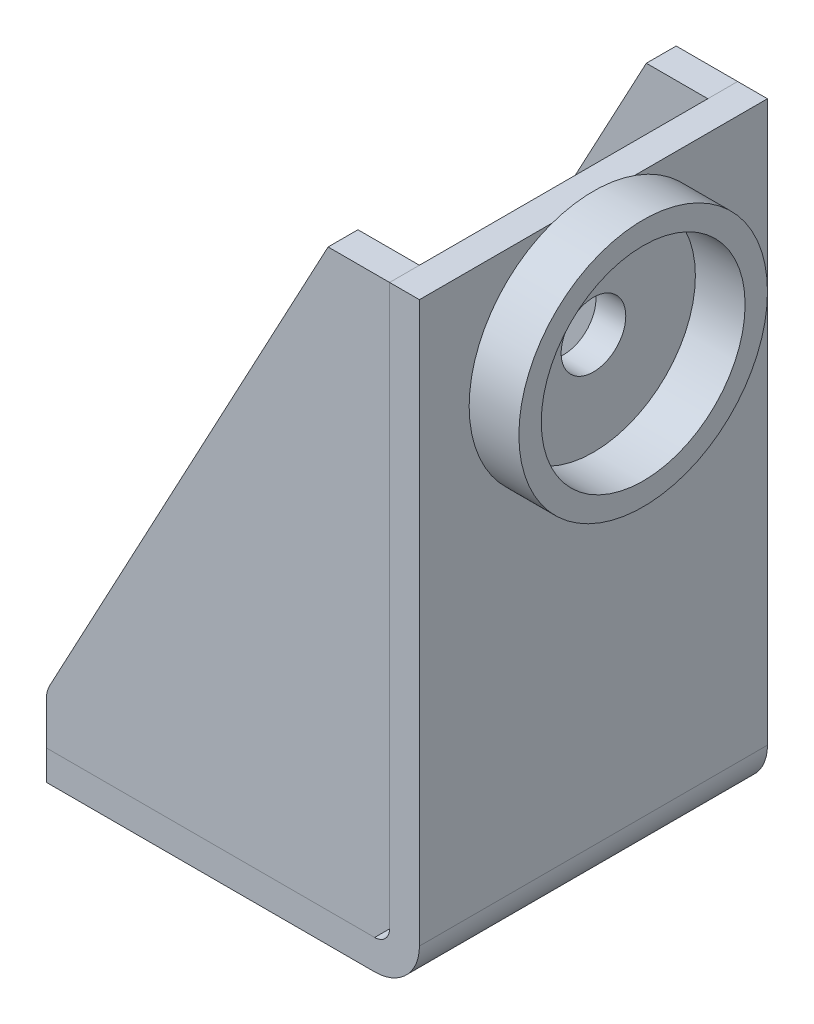
ISO-10303-21;
HEADER;
FILE_DESCRIPTION(('STEP AP214'),'2;1');
FILE_NAME('part.step','',(''),(''),'','','');
FILE_SCHEMA(('AUTOMOTIVE_DESIGN { 1 0 10303 214 1 1 1 1 }'));
ENDSEC;
DATA;
#1=APPLICATION_CONTEXT('core data for automotive mechanical design processes');
#2=APPLICATION_PROTOCOL_DEFINITION('international standard','automotive_design',2000,#1);
#3=PRODUCT_CONTEXT('',#1,'mechanical');
#4=PRODUCT('Part','Part','',(#3));
#5=PRODUCT_RELATED_PRODUCT_CATEGORY('part','',(#4));
#6=PRODUCT_DEFINITION_FORMATION('','',#4);
#7=PRODUCT_DEFINITION_CONTEXT('part definition',#1,'design');
#8=PRODUCT_DEFINITION('design','',#6,#7);
#9=PRODUCT_DEFINITION_SHAPE('','',#8);
#10=(LENGTH_UNIT() NAMED_UNIT(*) SI_UNIT(.MILLI.,.METRE.));
#11=(NAMED_UNIT(*) PLANE_ANGLE_UNIT() SI_UNIT($,.RADIAN.));
#12=(NAMED_UNIT(*) SI_UNIT($,.STERADIAN.) SOLID_ANGLE_UNIT());
#13=UNCERTAINTY_MEASURE_WITH_UNIT(LENGTH_MEASURE(1.E-05),#10,'distance_accuracy_value','');
#14=(GEOMETRIC_REPRESENTATION_CONTEXT(3) GLOBAL_UNCERTAINTY_ASSIGNED_CONTEXT((#13)) GLOBAL_UNIT_ASSIGNED_CONTEXT((#10,
#11,#12)) REPRESENTATION_CONTEXT('',''));
#15=CARTESIAN_POINT('',(0.,0.,0.));
#16=DIRECTION('',(0.,0.,1.));
#17=DIRECTION('',(1.,0.,0.));
#18=AXIS2_PLACEMENT_3D('',#15,#16,#17);
#19=CARTESIAN_POINT('',(0.,0.,9.86));
#20=DIRECTION('',(0.,0.,1.));
#21=DIRECTION('',(1.,0.,0.));
#22=AXIS2_PLACEMENT_3D('',#19,#20,#21);
#23=PLANE('',#22);
#24=DIRECTION('',(-0.472665982886393,-0.88124166300853,0.));
#25=VECTOR('',#24,1.);
#26=CARTESIAN_POINT('',(20.06,40.8,9.86));
#27=LINE('',#26,#25);
#28=CARTESIAN_POINT('',(19.2554545454546,39.3,9.86));
#29=VERTEX_POINT('',#28);
#30=CARTESIAN_POINT('',(0.201889172885499,3.77640354266788,9.86));
#31=VERTEX_POINT('',#30);
#32=EDGE_CURVE('E114',#29,#31,#27,.T.);
#33=ORIENTED_EDGE('',*,*,#32,.F.);
#34=DIRECTION('',(1.,0.,0.));
#35=VECTOR('',#34,1.);
#36=CARTESIAN_POINT('',(0.,39.3,9.86));
#37=LINE('',#36,#35);
#38=CARTESIAN_POINT('',(23.46,39.3,9.86));
#39=VERTEX_POINT('',#38);
#40=EDGE_CURVE('E209',#29,#39,#37,.T.);
#41=ORIENTED_EDGE('',*,*,#40,.T.);
#42=DIRECTION('',(0.,1.,0.));
#43=VECTOR('',#42,1.);
#44=CARTESIAN_POINT('',(23.46,1.02,9.86));
#45=LINE('',#44,#43);
#46=CARTESIAN_POINT('',(23.46,1.02,9.86));
#47=VERTEX_POINT('',#46);
#48=EDGE_CURVE('E134',#47,#39,#45,.T.);
#49=ORIENTED_EDGE('',*,*,#48,.F.);
#50=DIRECTION('',(0.707106781186546,0.707106781186549,0.));
#51=VECTOR('',#50,1.);
#52=CARTESIAN_POINT('',(22.44,0.,9.86));
#53=LINE('',#52,#51);
#54=CARTESIAN_POINT('',(22.44,0.,9.86));
#55=VERTEX_POINT('',#54);
#56=EDGE_CURVE('E140',#55,#47,#53,.T.);
#57=ORIENTED_EDGE('',*,*,#56,.F.);
#58=DIRECTION('',(1.,0.,0.));
#59=VECTOR('',#58,1.);
#60=CARTESIAN_POINT('',(0.,0.,9.86));
#61=LINE('',#60,#59);
#62=CARTESIAN_POINT('',(0.,0.,9.86));
#63=VERTEX_POINT('',#62);
#64=EDGE_CURVE('E118',#63,#55,#61,.T.);
#65=ORIENTED_EDGE('',*,*,#64,.F.);
#66=DIRECTION('',(0.,-1.,0.));
#67=VECTOR('',#66,1.);
#68=CARTESIAN_POINT('',(0.,3.4,9.86));
#69=LINE('',#68,#67);
#70=CARTESIAN_POINT('',(0.,2.97287137176101,9.86));
#71=VERTEX_POINT('',#70);
#72=EDGE_CURVE('E116',#71,#63,#69,.T.);
#73=ORIENTED_EDGE('',*,*,#72,.F.);
#74=CARTESIAN_POINT('',(1.7,2.97287137176101,9.86));
#75=DIRECTION('',(0.,0.,1.));
#76=DIRECTION('',(1.,0.,0.));
#77=AXIS2_PLACEMENT_3D('',#74,#75,#76);
#78=CIRCLE('',#77,1.7);
#79=EDGE_CURVE('E103',#31,#71,#78,.T.);
#80=ORIENTED_EDGE('',*,*,#79,.F.);
#81=EDGE_LOOP('',(#33,#41,#49,#57,#65,#73,#80));
#82=FACE_BOUND('',#81,.T.);
#83=ADVANCED_FACE('F49',(#82),#23,.F.);
#84=CARTESIAN_POINT('',(20.06,40.8,9.86));
#85=DIRECTION('',(-0.88124166300853,0.472665982886393,0.));
#86=DIRECTION('',(-0.472665982886393,-0.88124166300853,0.));
#87=AXIS2_PLACEMENT_3D('',#84,#85,#86);
#88=PLANE('',#87);
#89=DIRECTION('',(0.,0.,1.));
#90=VECTOR('',#89,1.);
#91=CARTESIAN_POINT('',(19.2554545454545,39.3,9.86));
#92=LINE('',#91,#90);
#93=CARTESIAN_POINT('',(19.2554545454545,39.3,11.9));
#94=VERTEX_POINT('',#93);
#95=EDGE_CURVE('E62',#29,#94,#92,.T.);
#96=ORIENTED_EDGE('',*,*,#95,.F.);
#97=ORIENTED_EDGE('',*,*,#32,.T.);
#98=DIRECTION('',(0.,0.,1.));
#99=VECTOR('',#98,1.);
#100=CARTESIAN_POINT('',(0.201889172885497,3.77640354266788,9.86));
#101=LINE('',#100,#99);
#102=CARTESIAN_POINT('',(0.201889172885499,3.77640354266788,11.9));
#103=VERTEX_POINT('',#102);
#104=EDGE_CURVE('E111',#103,#31,#101,.F.);
#105=ORIENTED_EDGE('',*,*,#104,.F.);
#106=DIRECTION('',(-0.472665982886393,-0.88124166300853,0.));
#107=VECTOR('',#106,1.);
#108=CARTESIAN_POINT('',(19.5791672553046,39.9035321709069,11.9));
#109=LINE('',#108,#107);
#110=EDGE_CURVE('E137',#94,#103,#109,.T.);
#111=ORIENTED_EDGE('',*,*,#110,.F.);
#112=EDGE_LOOP('',(#96,#97,#105,#111));
#113=FACE_BOUND('',#112,.T.);
#114=ADVANCED_FACE('F202',(#113),#88,.T.);
#115=CARTESIAN_POINT('',(1.7,2.97287137176101,9.86));
#116=DIRECTION('',(0.,0.,1.));
#117=DIRECTION('',(1.,0.,0.));
#118=AXIS2_PLACEMENT_3D('',#115,#116,#117);
#119=CYLINDRICAL_SURFACE('',#118,1.7);
#120=CARTESIAN_POINT('',(1.7,2.97287137176101,11.9));
#121=DIRECTION('',(0.,0.,1.));
#122=DIRECTION('',(1.,0.,0.));
#123=AXIS2_PLACEMENT_3D('',#120,#121,#122);
#124=CIRCLE('',#123,1.7);
#125=CARTESIAN_POINT('',(0.,2.97287137176101,11.9));
#126=VERTEX_POINT('',#125);
#127=EDGE_CURVE('E150',#103,#126,#124,.T.);
#128=ORIENTED_EDGE('',*,*,#127,.F.);
#129=ORIENTED_EDGE('',*,*,#104,.T.);
#130=ORIENTED_EDGE('',*,*,#79,.T.);
#131=DIRECTION('',(0.,0.,1.));
#132=VECTOR('',#131,1.);
#133=CARTESIAN_POINT('',(0.,2.97287137176101,9.86));
#134=LINE('',#133,#132);
#135=EDGE_CURVE('E108',#126,#71,#134,.F.);
#136=ORIENTED_EDGE('',*,*,#135,.F.);
#137=EDGE_LOOP('',(#128,#129,#130,#136));
#138=FACE_BOUND('',#137,.T.);
#139=ADVANCED_FACE('F106',(#138),#119,.T.);
#140=CARTESIAN_POINT('',(0.,3.4,9.86));
#141=DIRECTION('',(-1.,0.,0.));
#142=DIRECTION('',(0.,-1.,0.));
#143=AXIS2_PLACEMENT_3D('',#140,#141,#142);
#144=PLANE('',#143);
#145=ORIENTED_EDGE('',*,*,#72,.T.);
#146=DIRECTION('',(0.,0.,-1.));
#147=VECTOR('',#146,1.);
#148=CARTESIAN_POINT('',(0.,0.,9.86));
#149=LINE('',#148,#147);
#150=CARTESIAN_POINT('',(0.,0.,11.9));
#151=VERTEX_POINT('',#150);
#152=EDGE_CURVE('E121',#151,#63,#149,.T.);
#153=ORIENTED_EDGE('',*,*,#152,.F.);
#154=DIRECTION('',(0.,1.,0.));
#155=VECTOR('',#154,1.);
#156=CARTESIAN_POINT('',(0.,0.,11.9));
#157=LINE('',#156,#155);
#158=EDGE_CURVE('E125',#126,#151,#157,.F.);
#159=ORIENTED_EDGE('',*,*,#158,.F.);
#160=ORIENTED_EDGE('',*,*,#135,.T.);
#161=EDGE_LOOP('',(#145,#153,#159,#160));
#162=FACE_BOUND('',#161,.T.);
#163=ADVANCED_FACE('F123',(#162),#144,.T.);
#164=CARTESIAN_POINT('',(0.,0.,9.86));
#165=DIRECTION('',(0.,-1.,0.));
#166=DIRECTION('',(0.,0.,-1.));
#167=AXIS2_PLACEMENT_3D('',#164,#165,#166);
#168=PLANE('',#167);
#169=ORIENTED_EDGE('',*,*,#64,.T.);
#170=DIRECTION('',(0.,0.,1.));
#171=VECTOR('',#170,1.);
#172=CARTESIAN_POINT('',(22.44,0.,9.86));
#173=LINE('',#172,#171);
#174=CARTESIAN_POINT('',(22.44,0.,11.9));
#175=VERTEX_POINT('',#174);
#176=EDGE_CURVE('E142',#175,#55,#173,.F.);
#177=ORIENTED_EDGE('',*,*,#176,.F.);
#178=DIRECTION('',(1.,0.,0.));
#179=VECTOR('',#178,1.);
#180=CARTESIAN_POINT('',(0.,0.,11.9));
#181=LINE('',#180,#179);
#182=EDGE_CURVE('E152',#151,#175,#181,.T.);
#183=ORIENTED_EDGE('',*,*,#182,.F.);
#184=ORIENTED_EDGE('',*,*,#152,.T.);
#185=EDGE_LOOP('',(#169,#177,#183,#184));
#186=FACE_BOUND('',#185,.T.);
#187=ADVANCED_FACE('F180',(#186),#168,.T.);
#188=CARTESIAN_POINT('',(22.44,0.,9.86));
#189=DIRECTION('',(0.707106781186549,-0.707106781186546,0.));
#190=DIRECTION('',(0.707106781186546,0.707106781186549,0.));
#191=AXIS2_PLACEMENT_3D('',#188,#189,#190);
#192=PLANE('',#191);
#193=ORIENTED_EDGE('',*,*,#56,.T.);
#194=DIRECTION('',(0.,0.,-1.));
#195=VECTOR('',#194,1.);
#196=CARTESIAN_POINT('',(23.46,1.02,9.86));
#197=LINE('',#196,#195);
#198=CARTESIAN_POINT('',(23.46,1.02,11.9));
#199=VERTEX_POINT('',#198);
#200=EDGE_CURVE('E71',#199,#47,#197,.T.);
#201=ORIENTED_EDGE('',*,*,#200,.F.);
#202=DIRECTION('',(0.707106781186546,0.707106781186549,0.));
#203=VECTOR('',#202,1.);
#204=CARTESIAN_POINT('',(22.44,0.,11.9));
#205=LINE('',#204,#203);
#206=EDGE_CURVE('E161',#175,#199,#205,.T.);
#207=ORIENTED_EDGE('',*,*,#206,.F.);
#208=ORIENTED_EDGE('',*,*,#176,.T.);
#209=EDGE_LOOP('',(#193,#201,#207,#208));
#210=FACE_BOUND('',#209,.T.);
#211=ADVANCED_FACE('F191',(#210),#192,.T.);
#212=CARTESIAN_POINT('',(23.46,1.02,9.86));
#213=DIRECTION('',(1.,0.,0.));
#214=DIRECTION('',(0.,0.,-1.));
#215=AXIS2_PLACEMENT_3D('',#212,#213,#214);
#216=PLANE('',#215);
#217=DIRECTION('',(0.,0.,-1.));
#218=VECTOR('',#217,1.);
#219=CARTESIAN_POINT('',(23.46,39.3,9.86));
#220=LINE('',#219,#218);
#221=CARTESIAN_POINT('',(23.46,39.3,11.9));
#222=VERTEX_POINT('',#221);
#223=EDGE_CURVE('E215',#222,#39,#220,.T.);
#224=ORIENTED_EDGE('',*,*,#223,.F.);
#225=DIRECTION('',(0.,1.,0.));
#226=VECTOR('',#225,1.);
#227=CARTESIAN_POINT('',(23.46,0.,11.9));
#228=LINE('',#227,#226);
#229=EDGE_CURVE('E56',#199,#222,#228,.T.);
#230=ORIENTED_EDGE('',*,*,#229,.F.);
#231=ORIENTED_EDGE('',*,*,#200,.T.);
#232=ORIENTED_EDGE('',*,*,#48,.T.);
#233=EDGE_LOOP('',(#224,#230,#231,#232));
#234=FACE_BOUND('',#233,.T.);
#235=ADVANCED_FACE('F184',(#234),#216,.T.);
#236=CARTESIAN_POINT('',(0.,0.,11.9));
#237=DIRECTION('',(0.,0.,1.));
#238=DIRECTION('',(1.,0.,0.));
#239=AXIS2_PLACEMENT_3D('',#236,#237,#238);
#240=PLANE('',#239);
#241=DIRECTION('',(1.,0.,0.));
#242=VECTOR('',#241,1.);
#243=CARTESIAN_POINT('',(0.,39.3,11.9));
#244=LINE('',#243,#242);
#245=EDGE_CURVE('E12',#94,#222,#244,.T.);
#246=ORIENTED_EDGE('',*,*,#245,.F.);
#247=ORIENTED_EDGE('',*,*,#110,.T.);
#248=ORIENTED_EDGE('',*,*,#127,.T.);
#249=ORIENTED_EDGE('',*,*,#158,.T.);
#250=ORIENTED_EDGE('',*,*,#182,.T.);
#251=ORIENTED_EDGE('',*,*,#206,.T.);
#252=ORIENTED_EDGE('',*,*,#229,.T.);
#253=EDGE_LOOP('',(#246,#247,#248,#249,#250,#251,#252));
#254=FACE_BOUND('',#253,.T.);
#255=ADVANCED_FACE('F181',(#254),#240,.T.);
#256=CARTESIAN_POINT('',(0.,39.3,0.));
#257=DIRECTION('',(0.,-1.,0.));
#258=DIRECTION('',(0.,0.,-1.));
#259=AXIS2_PLACEMENT_3D('',#256,#257,#258);
#260=PLANE('',#259);
#261=ORIENTED_EDGE('',*,*,#95,.T.);
#262=ORIENTED_EDGE('',*,*,#245,.T.);
#263=ORIENTED_EDGE('',*,*,#223,.T.);
#264=ORIENTED_EDGE('',*,*,#40,.F.);
#265=EDGE_LOOP('',(#261,#262,#263,#264));
#266=FACE_BOUND('',#265,.T.);
#267=ADVANCED_FACE('F183',(#266),#260,.F.);
#268=CLOSED_SHELL('',(#83,#114,#139,#163,#187,#211,#235,#255,#267));
#269=MANIFOLD_SOLID_BREP('B2',#268);
#270=CARTESIAN_POINT('',(0.,0.,11.9));
#271=DIRECTION('',(0.,1.,0.));
#272=DIRECTION('',(0.,0.,1.));
#273=AXIS2_PLACEMENT_3D('',#270,#271,#272);
#274=PLANE('',#273);
#275=DIRECTION('',(-1.,0.,0.));
#276=VECTOR('',#275,1.);
#277=CARTESIAN_POINT('',(22.44,0.,11.9));
#278=LINE('',#277,#276);
#279=CARTESIAN_POINT('',(0.,0.,11.9));
#280=VERTEX_POINT('',#279);
#281=CARTESIAN_POINT('',(22.44,0.,11.9));
#282=VERTEX_POINT('',#281);
#283=EDGE_CURVE('E409',#280,#282,#278,.F.);
#284=ORIENTED_EDGE('',*,*,#283,.T.);
#285=DIRECTION('',(0.,0.,-1.));
#286=VECTOR('',#285,1.);
#287=CARTESIAN_POINT('',(22.44,0.,11.9));
#288=LINE('',#287,#286);
#289=CARTESIAN_POINT('',(22.44,0.,-11.9));
#290=VERTEX_POINT('',#289);
#291=EDGE_CURVE('E334',#282,#290,#288,.T.);
#292=ORIENTED_EDGE('',*,*,#291,.T.);
#293=DIRECTION('',(-1.,0.,0.));
#294=VECTOR('',#293,1.);
#295=CARTESIAN_POINT('',(25.5,0.,-11.9));
#296=LINE('',#295,#294);
#297=CARTESIAN_POINT('',(0.,0.,-11.9));
#298=VERTEX_POINT('',#297);
#299=EDGE_CURVE('E407',#298,#290,#296,.F.);
#300=ORIENTED_EDGE('',*,*,#299,.F.);
#301=DIRECTION('',(0.,0.,1.));
#302=VECTOR('',#301,1.);
#303=CARTESIAN_POINT('',(0.,0.,11.9));
#304=LINE('',#303,#302);
#305=EDGE_CURVE('E351',#280,#298,#304,.F.);
#306=ORIENTED_EDGE('',*,*,#305,.F.);
#307=EDGE_LOOP('',(#284,#292,#300,#306));
#308=FACE_BOUND('',#307,.T.);
#309=CARTESIAN_POINT('',(5.1,0.,-5.1));
#310=DIRECTION('',(0.,1.,0.));
#311=DIRECTION('',(0.,0.,1.));
#312=AXIS2_PLACEMENT_3D('',#309,#310,#311);
#313=CIRCLE('',#312,1.53);
#314=CARTESIAN_POINT('',(5.1,0.,-3.57));
#315=VERTEX_POINT('',#314);
#316=EDGE_CURVE('E428',#315,#315,#313,.F.);
#317=ORIENTED_EDGE('',*,*,#316,.T.);
#318=EDGE_LOOP('',(#317));
#319=FACE_BOUND('',#318,.T.);
#320=CARTESIAN_POINT('',(18.7,0.,-5.1));
#321=DIRECTION('',(0.,1.,0.));
#322=DIRECTION('',(0.,0.,1.));
#323=AXIS2_PLACEMENT_3D('',#320,#321,#322);
#324=CIRCLE('',#323,1.53);
#325=CARTESIAN_POINT('',(18.7,0.,-3.56999999999999));
#326=VERTEX_POINT('',#325);
#327=EDGE_CURVE('E453',#326,#326,#324,.F.);
#328=ORIENTED_EDGE('',*,*,#327,.T.);
#329=EDGE_LOOP('',(#328));
#330=FACE_BOUND('',#329,.T.);
#331=CARTESIAN_POINT('',(18.7,0.,5.1));
#332=DIRECTION('',(0.,1.,0.));
#333=DIRECTION('',(0.,0.,1.));
#334=AXIS2_PLACEMENT_3D('',#331,#332,#333);
#335=CIRCLE('',#334,1.53000000000001);
#336=CARTESIAN_POINT('',(18.7,0.,6.63000000000001));
#337=VERTEX_POINT('',#336);
#338=EDGE_CURVE('E456',#337,#337,#335,.F.);
#339=ORIENTED_EDGE('',*,*,#338,.T.);
#340=EDGE_LOOP('',(#339));
#341=FACE_BOUND('',#340,.T.);
#342=CARTESIAN_POINT('',(5.1,0.,5.1));
#343=DIRECTION('',(0.,1.,0.));
#344=DIRECTION('',(0.,0.,1.));
#345=AXIS2_PLACEMENT_3D('',#342,#343,#344);
#346=CIRCLE('',#345,1.53000000000001);
#347=CARTESIAN_POINT('',(5.1,0.,6.63000000000001));
#348=VERTEX_POINT('',#347);
#349=EDGE_CURVE('E371',#348,#348,#346,.F.);
#350=ORIENTED_EDGE('',*,*,#349,.T.);
#351=EDGE_LOOP('',(#350));
#352=FACE_BOUND('',#351,.T.);
#353=ADVANCED_FACE('F282',(#308,#319,#330,#341,#352),#274,.T.);
#354=CARTESIAN_POINT('',(5.1,-2.04034,5.1));
#355=DIRECTION('',(0.,1.,0.));
#356=DIRECTION('',(0.,0.,1.));
#357=AXIS2_PLACEMENT_3D('',#354,#355,#356);
#358=CYLINDRICAL_SURFACE('',#357,1.53000000000001);
#359=ORIENTED_EDGE('',*,*,#349,.F.);
#360=EDGE_LOOP('',(#359));
#361=FACE_BOUND('',#360,.T.);
#362=CARTESIAN_POINT('',(5.1,-2.04,5.1));
#363=DIRECTION('',(0.,1.,0.));
#364=DIRECTION('',(0.,0.,1.));
#365=AXIS2_PLACEMENT_3D('',#362,#363,#364);
#366=CIRCLE('',#365,1.53000000000001);
#367=CARTESIAN_POINT('',(5.1,-2.04,6.63000000000001));
#368=VERTEX_POINT('',#367);
#369=EDGE_CURVE('E405',#368,#368,#366,.F.);
#370=ORIENTED_EDGE('',*,*,#369,.T.);
#371=EDGE_LOOP('',(#370));
#372=FACE_BOUND('',#371,.T.);
#373=ADVANCED_FACE('F463',(#361,#372),#358,.F.);
#374=CARTESIAN_POINT('',(18.7,-2.04034,5.1));
#375=DIRECTION('',(0.,1.,0.));
#376=DIRECTION('',(0.,0.,1.));
#377=AXIS2_PLACEMENT_3D('',#374,#375,#376);
#378=CYLINDRICAL_SURFACE('',#377,1.53000000000001);
#379=ORIENTED_EDGE('',*,*,#338,.F.);
#380=EDGE_LOOP('',(#379));
#381=FACE_BOUND('',#380,.T.);
#382=CARTESIAN_POINT('',(18.7,-2.04,5.1));
#383=DIRECTION('',(0.,1.,0.));
#384=DIRECTION('',(0.,0.,1.));
#385=AXIS2_PLACEMENT_3D('',#382,#383,#384);
#386=CIRCLE('',#385,1.53000000000001);
#387=CARTESIAN_POINT('',(18.7,-2.04,6.63000000000001));
#388=VERTEX_POINT('',#387);
#389=EDGE_CURVE('E446',#388,#388,#386,.F.);
#390=ORIENTED_EDGE('',*,*,#389,.T.);
#391=EDGE_LOOP('',(#390));
#392=FACE_BOUND('',#391,.T.);
#393=ADVANCED_FACE('F466',(#381,#392),#378,.F.);
#394=CARTESIAN_POINT('',(18.7,-2.04034,-5.1));
#395=DIRECTION('',(0.,1.,0.));
#396=DIRECTION('',(0.,0.,1.));
#397=AXIS2_PLACEMENT_3D('',#394,#395,#396);
#398=CYLINDRICAL_SURFACE('',#397,1.53);
#399=ORIENTED_EDGE('',*,*,#327,.F.);
#400=EDGE_LOOP('',(#399));
#401=FACE_BOUND('',#400,.T.);
#402=CARTESIAN_POINT('',(18.7,-2.04,-5.1));
#403=DIRECTION('',(0.,1.,0.));
#404=DIRECTION('',(0.,0.,1.));
#405=AXIS2_PLACEMENT_3D('',#402,#403,#404);
#406=CIRCLE('',#405,1.53);
#407=CARTESIAN_POINT('',(18.7,-2.04,-3.56999999999999));
#408=VERTEX_POINT('',#407);
#409=EDGE_CURVE('E443',#408,#408,#406,.F.);
#410=ORIENTED_EDGE('',*,*,#409,.T.);
#411=EDGE_LOOP('',(#410));
#412=FACE_BOUND('',#411,.T.);
#413=ADVANCED_FACE('F554',(#401,#412),#398,.F.);
#414=CARTESIAN_POINT('',(5.1,-2.04034,-5.1));
#415=DIRECTION('',(0.,1.,0.));
#416=DIRECTION('',(0.,0.,1.));
#417=AXIS2_PLACEMENT_3D('',#414,#415,#416);
#418=CYLINDRICAL_SURFACE('',#417,1.53);
#419=ORIENTED_EDGE('',*,*,#316,.F.);
#420=EDGE_LOOP('',(#419));
#421=FACE_BOUND('',#420,.T.);
#422=CARTESIAN_POINT('',(5.1,-2.04,-5.1));
#423=DIRECTION('',(0.,1.,0.));
#424=DIRECTION('',(0.,0.,1.));
#425=AXIS2_PLACEMENT_3D('',#422,#423,#424);
#426=CIRCLE('',#425,1.53);
#427=CARTESIAN_POINT('',(5.1,-2.04,-3.57));
#428=VERTEX_POINT('',#427);
#429=EDGE_CURVE('E421',#428,#428,#426,.F.);
#430=ORIENTED_EDGE('',*,*,#429,.T.);
#431=EDGE_LOOP('',(#430));
#432=FACE_BOUND('',#431,.T.);
#433=ADVANCED_FACE('F545',(#421,#432),#418,.F.);
#434=CARTESIAN_POINT('',(0.,-2.04,11.9));
#435=DIRECTION('',(-1.,0.,0.));
#436=DIRECTION('',(0.,0.,1.));
#437=AXIS2_PLACEMENT_3D('',#434,#435,#436);
#438=PLANE('',#437);
#439=DIRECTION('',(0.,1.,0.));
#440=VECTOR('',#439,1.);
#441=CARTESIAN_POINT('',(0.,1.02,11.9));
#442=LINE('',#441,#440);
#443=CARTESIAN_POINT('',(0.,-2.04,11.9));
#444=VERTEX_POINT('',#443);
#445=EDGE_CURVE('E341',#444,#280,#442,.T.);
#446=ORIENTED_EDGE('',*,*,#445,.T.);
#447=ORIENTED_EDGE('',*,*,#305,.T.);
#448=DIRECTION('',(0.,1.,0.));
#449=VECTOR('',#448,1.);
#450=CARTESIAN_POINT('',(0.,1.02,-11.9));
#451=LINE('',#450,#449);
#452=CARTESIAN_POINT('',(0.,-2.04,-11.9));
#453=VERTEX_POINT('',#452);
#454=EDGE_CURVE('E406',#453,#298,#451,.T.);
#455=ORIENTED_EDGE('',*,*,#454,.F.);
#456=DIRECTION('',(0.,0.,1.));
#457=VECTOR('',#456,1.);
#458=CARTESIAN_POINT('',(0.,-2.04,11.9));
#459=LINE('',#458,#457);
#460=EDGE_CURVE('E418',#453,#444,#459,.T.);
#461=ORIENTED_EDGE('',*,*,#460,.T.);
#462=EDGE_LOOP('',(#446,#447,#455,#461));
#463=FACE_BOUND('',#462,.T.);
#464=ADVANCED_FACE('F480',(#463),#438,.T.);
#465=CARTESIAN_POINT('',(22.44,1.02,11.9));
#466=DIRECTION('',(0.,0.,-1.));
#467=DIRECTION('',(-1.,0.,0.));
#468=AXIS2_PLACEMENT_3D('',#465,#466,#467);
#469=CYLINDRICAL_SURFACE('',#468,1.02);
#470=ORIENTED_EDGE('',*,*,#291,.F.);
#471=CARTESIAN_POINT('',(22.44,1.02,11.9));
#472=DIRECTION('',(0.,0.,-1.));
#473=DIRECTION('',(-1.,0.,0.));
#474=AXIS2_PLACEMENT_3D('',#471,#472,#473);
#475=CIRCLE('',#474,1.02);
#476=CARTESIAN_POINT('',(23.46,1.02,11.9));
#477=VERTEX_POINT('',#476);
#478=EDGE_CURVE('E400',#477,#282,#475,.T.);
#479=ORIENTED_EDGE('',*,*,#478,.F.);
#480=DIRECTION('',(0.,0.,1.));
#481=VECTOR('',#480,1.);
#482=CARTESIAN_POINT('',(23.46,1.02,11.9));
#483=LINE('',#482,#481);
#484=CARTESIAN_POINT('',(23.46,1.02,-11.9));
#485=VERTEX_POINT('',#484);
#486=EDGE_CURVE('E380',#485,#477,#483,.T.);
#487=ORIENTED_EDGE('',*,*,#486,.F.);
#488=CARTESIAN_POINT('',(22.44,1.02,-11.9));
#489=DIRECTION('',(0.,0.,-1.));
#490=DIRECTION('',(-1.,0.,0.));
#491=AXIS2_PLACEMENT_3D('',#488,#489,#490);
#492=CIRCLE('',#491,1.02);
#493=EDGE_CURVE('E438',#290,#485,#492,.F.);
#494=ORIENTED_EDGE('',*,*,#493,.F.);
#495=EDGE_LOOP('',(#470,#479,#487,#494));
#496=FACE_BOUND('',#495,.T.);
#497=ADVANCED_FACE('F471',(#496),#469,.F.);
#498=CARTESIAN_POINT('',(0.,-2.04,11.9));
#499=DIRECTION('',(0.,1.,0.));
#500=DIRECTION('',(0.,0.,1.));
#501=AXIS2_PLACEMENT_3D('',#498,#499,#500);
#502=PLANE('',#501);
#503=DIRECTION('',(0.,0.,-1.));
#504=VECTOR('',#503,1.);
#505=CARTESIAN_POINT('',(22.44,-2.04,11.9));
#506=LINE('',#505,#504);
#507=CARTESIAN_POINT('',(22.44,-2.04,11.9));
#508=VERTEX_POINT('',#507);
#509=CARTESIAN_POINT('',(22.44,-2.04,-11.9));
#510=VERTEX_POINT('',#509);
#511=EDGE_CURVE('E382',#508,#510,#506,.T.);
#512=ORIENTED_EDGE('',*,*,#511,.F.);
#513=DIRECTION('',(1.,0.,0.));
#514=VECTOR('',#513,1.);
#515=CARTESIAN_POINT('',(0.,-2.04,11.9));
#516=LINE('',#515,#514);
#517=EDGE_CURVE('E401',#444,#508,#516,.T.);
#518=ORIENTED_EDGE('',*,*,#517,.F.);
#519=ORIENTED_EDGE('',*,*,#460,.F.);
#520=DIRECTION('',(1.,0.,0.));
#521=VECTOR('',#520,1.);
#522=CARTESIAN_POINT('',(0.,-2.04,-11.9));
#523=LINE('',#522,#521);
#524=EDGE_CURVE('E397',#510,#453,#523,.F.);
#525=ORIENTED_EDGE('',*,*,#524,.F.);
#526=EDGE_LOOP('',(#512,#518,#519,#525));
#527=FACE_BOUND('',#526,.T.);
#528=ORIENTED_EDGE('',*,*,#429,.F.);
#529=EDGE_LOOP('',(#528));
#530=FACE_BOUND('',#529,.T.);
#531=ORIENTED_EDGE('',*,*,#409,.F.);
#532=EDGE_LOOP('',(#531));
#533=FACE_BOUND('',#532,.T.);
#534=ORIENTED_EDGE('',*,*,#389,.F.);
#535=EDGE_LOOP('',(#534));
#536=FACE_BOUND('',#535,.T.);
#537=ORIENTED_EDGE('',*,*,#369,.F.);
#538=EDGE_LOOP('',(#537));
#539=FACE_BOUND('',#538,.T.);
#540=ADVANCED_FACE('F469',(#527,#530,#533,#536,#539),#502,.F.);
#541=CARTESIAN_POINT('',(23.46,0.,11.9));
#542=DIRECTION('',(-1.,0.,0.));
#543=DIRECTION('',(0.,0.,1.));
#544=AXIS2_PLACEMENT_3D('',#541,#542,#543);
#545=PLANE('',#544);
#546=DIRECTION('',(0.,0.,1.));
#547=VECTOR('',#546,1.);
#548=CARTESIAN_POINT('',(23.46,39.3,11.9));
#549=LINE('',#548,#547);
#550=CARTESIAN_POINT('',(23.46,39.3,-11.9));
#551=VERTEX_POINT('',#550);
#552=CARTESIAN_POINT('',(23.46,39.3,11.9));
#553=VERTEX_POINT('',#552);
#554=EDGE_CURVE('E365',#551,#553,#549,.T.);
#555=ORIENTED_EDGE('',*,*,#554,.F.);
#556=DIRECTION('',(0.,1.,0.));
#557=VECTOR('',#556,1.);
#558=CARTESIAN_POINT('',(23.46,1.02,-11.9));
#559=LINE('',#558,#557);
#560=EDGE_CURVE('E381',#485,#551,#559,.T.);
#561=ORIENTED_EDGE('',*,*,#560,.F.);
#562=ORIENTED_EDGE('',*,*,#486,.T.);
#563=DIRECTION('',(0.,1.,0.));
#564=VECTOR('',#563,1.);
#565=CARTESIAN_POINT('',(23.46,-2.04,11.9));
#566=LINE('',#565,#564);
#567=EDGE_CURVE('E285',#553,#477,#566,.F.);
#568=ORIENTED_EDGE('',*,*,#567,.F.);
#569=EDGE_LOOP('',(#555,#561,#562,#568));
#570=FACE_BOUND('',#569,.T.);
#571=CARTESIAN_POINT('',(23.46,31.28,0.));
#572=DIRECTION('',(1.,0.,0.));
#573=DIRECTION('',(0.,0.,-1.));
#574=AXIS2_PLACEMENT_3D('',#571,#572,#573);
#575=CIRCLE('',#574,2.21);
#576=CARTESIAN_POINT('',(23.46,31.28,-2.21));
#577=VERTEX_POINT('',#576);
#578=EDGE_CURVE('E435',#577,#577,#575,.T.);
#579=ORIENTED_EDGE('',*,*,#578,.T.);
#580=EDGE_LOOP('',(#579));
#581=FACE_BOUND('',#580,.T.);
#582=ADVANCED_FACE('F377',(#570,#581),#545,.T.);
#583=CARTESIAN_POINT('',(-0.00034000000000034,31.28,0.));
#584=DIRECTION('',(1.,0.,0.));
#585=DIRECTION('',(0.,0.,-1.));
#586=AXIS2_PLACEMENT_3D('',#583,#584,#585);
#587=CYLINDRICAL_SURFACE('',#586,2.21);
#588=ORIENTED_EDGE('',*,*,#578,.F.);
#589=EDGE_LOOP('',(#588));
#590=FACE_BOUND('',#589,.T.);
#591=CARTESIAN_POINT('',(25.5,31.28,0.));
#592=DIRECTION('',(1.,0.,0.));
#593=DIRECTION('',(0.,0.,-1.));
#594=AXIS2_PLACEMENT_3D('',#591,#592,#593);
#595=CIRCLE('',#594,2.21);
#596=CARTESIAN_POINT('',(25.5,31.28,-2.21));
#597=VERTEX_POINT('',#596);
#598=EDGE_CURVE('E383',#597,#597,#595,.T.);
#599=ORIENTED_EDGE('',*,*,#598,.T.);
#600=EDGE_LOOP('',(#599));
#601=FACE_BOUND('',#600,.T.);
#602=ADVANCED_FACE('F478',(#590,#601),#587,.F.);
#603=CARTESIAN_POINT('',(22.44,1.02,11.9));
#604=DIRECTION('',(0.,0.,-1.));
#605=DIRECTION('',(-1.,0.,0.));
#606=AXIS2_PLACEMENT_3D('',#603,#604,#605);
#607=CYLINDRICAL_SURFACE('',#606,3.06);
#608=CARTESIAN_POINT('',(22.44,1.02,11.9));
#609=DIRECTION('',(0.,0.,-1.));
#610=DIRECTION('',(-1.,0.,0.));
#611=AXIS2_PLACEMENT_3D('',#608,#609,#610);
#612=CIRCLE('',#611,3.06);
#613=CARTESIAN_POINT('',(25.5,1.02,11.9));
#614=VERTEX_POINT('',#613);
#615=EDGE_CURVE('E306',#614,#508,#612,.T.);
#616=ORIENTED_EDGE('',*,*,#615,.T.);
#617=ORIENTED_EDGE('',*,*,#511,.T.);
#618=CARTESIAN_POINT('',(22.44,1.02,-11.9));
#619=DIRECTION('',(0.,0.,-1.));
#620=DIRECTION('',(-1.,0.,0.));
#621=AXIS2_PLACEMENT_3D('',#618,#619,#620);
#622=CIRCLE('',#621,3.06);
#623=CARTESIAN_POINT('',(25.5,1.02,-11.9));
#624=VERTEX_POINT('',#623);
#625=EDGE_CURVE('E391',#510,#624,#622,.F.);
#626=ORIENTED_EDGE('',*,*,#625,.T.);
#627=DIRECTION('',(0.,0.,1.));
#628=VECTOR('',#627,1.);
#629=CARTESIAN_POINT('',(25.5,1.02,11.9));
#630=LINE('',#629,#628);
#631=EDGE_CURVE('E432',#624,#614,#630,.T.);
#632=ORIENTED_EDGE('',*,*,#631,.T.);
#633=EDGE_LOOP('',(#616,#617,#626,#632));
#634=FACE_BOUND('',#633,.T.);
#635=ADVANCED_FACE('F500',(#634),#607,.T.);
#636=CARTESIAN_POINT('',(22.44,-2.04,11.9));
#637=DIRECTION('',(0.,0.,1.));
#638=DIRECTION('',(1.,0.,0.));
#639=AXIS2_PLACEMENT_3D('',#636,#637,#638);
#640=PLANE('',#639);
#641=DIRECTION('',(1.,0.,0.));
#642=VECTOR('',#641,1.);
#643=CARTESIAN_POINT('',(28.9667630312667,39.3,11.9));
#644=LINE('',#643,#642);
#645=CARTESIAN_POINT('',(25.5,39.3,11.9));
#646=VERTEX_POINT('',#645);
#647=EDGE_CURVE('E298',#553,#646,#644,.T.);
#648=ORIENTED_EDGE('',*,*,#647,.F.);
#649=ORIENTED_EDGE('',*,*,#567,.T.);
#650=ORIENTED_EDGE('',*,*,#478,.T.);
#651=ORIENTED_EDGE('',*,*,#283,.F.);
#652=ORIENTED_EDGE('',*,*,#445,.F.);
#653=ORIENTED_EDGE('',*,*,#517,.T.);
#654=ORIENTED_EDGE('',*,*,#615,.F.);
#655=DIRECTION('',(0.,1.,0.));
#656=VECTOR('',#655,1.);
#657=CARTESIAN_POINT('',(25.5,0.,11.9));
#658=LINE('',#657,#656);
#659=EDGE_CURVE('E375',#614,#646,#658,.T.);
#660=ORIENTED_EDGE('',*,*,#659,.T.);
#661=EDGE_LOOP('',(#648,#649,#650,#651,#652,#653,#654,#660));
#662=FACE_BOUND('',#661,.T.);
#663=ADVANCED_FACE('F373',(#662),#640,.T.);
#664=CARTESIAN_POINT('',(22.44,1.02,-11.9));
#665=DIRECTION('',(0.,0.,-1.));
#666=DIRECTION('',(-1.,0.,0.));
#667=AXIS2_PLACEMENT_3D('',#664,#665,#666);
#668=PLANE('',#667);
#669=DIRECTION('',(-1.,0.,0.));
#670=VECTOR('',#669,1.);
#671=CARTESIAN_POINT('',(28.9667630312667,39.3,-11.9));
#672=LINE('',#671,#670);
#673=CARTESIAN_POINT('',(25.5,39.3,-11.9));
#674=VERTEX_POINT('',#673);
#675=EDGE_CURVE('E360',#674,#551,#672,.T.);
#676=ORIENTED_EDGE('',*,*,#675,.F.);
#677=DIRECTION('',(0.,1.,0.));
#678=VECTOR('',#677,1.);
#679=CARTESIAN_POINT('',(25.5,0.,-11.9));
#680=LINE('',#679,#678);
#681=EDGE_CURVE('E291',#674,#624,#680,.F.);
#682=ORIENTED_EDGE('',*,*,#681,.T.);
#683=ORIENTED_EDGE('',*,*,#625,.F.);
#684=ORIENTED_EDGE('',*,*,#524,.T.);
#685=ORIENTED_EDGE('',*,*,#454,.T.);
#686=ORIENTED_EDGE('',*,*,#299,.T.);
#687=ORIENTED_EDGE('',*,*,#493,.T.);
#688=ORIENTED_EDGE('',*,*,#560,.T.);
#689=EDGE_LOOP('',(#676,#682,#683,#684,#685,#686,#687,#688));
#690=FACE_BOUND('',#689,.T.);
#691=ADVANCED_FACE('F485',(#690),#668,.T.);
#692=CARTESIAN_POINT('',(25.5,0.,11.9));
#693=DIRECTION('',(-1.,0.,0.));
#694=DIRECTION('',(0.,0.,1.));
#695=AXIS2_PLACEMENT_3D('',#692,#693,#694);
#696=PLANE('',#695);
#697=ORIENTED_EDGE('',*,*,#681,.F.);
#698=DIRECTION('',(0.,0.,1.));
#699=VECTOR('',#698,1.);
#700=CARTESIAN_POINT('',(25.5,39.3,11.9));
#701=LINE('',#700,#699);
#702=EDGE_CURVE('E47',#674,#646,#701,.T.);
#703=ORIENTED_EDGE('',*,*,#702,.T.);
#704=ORIENTED_EDGE('',*,*,#659,.F.);
#705=ORIENTED_EDGE('',*,*,#631,.F.);
#706=EDGE_LOOP('',(#697,#703,#704,#705));
#707=FACE_BOUND('',#706,.T.);
#708=ORIENTED_EDGE('',*,*,#598,.F.);
#709=EDGE_LOOP('',(#708));
#710=FACE_BOUND('',#709,.T.);
#711=ADVANCED_FACE('F483',(#707,#710),#696,.F.);
#712=CARTESIAN_POINT('',(0.,39.3,0.));
#713=DIRECTION('',(0.,-1.,0.));
#714=DIRECTION('',(0.,0.,-1.));
#715=AXIS2_PLACEMENT_3D('',#712,#713,#714);
#716=PLANE('',#715);
#717=ORIENTED_EDGE('',*,*,#554,.T.);
#718=ORIENTED_EDGE('',*,*,#647,.T.);
#719=ORIENTED_EDGE('',*,*,#702,.F.);
#720=ORIENTED_EDGE('',*,*,#675,.T.);
#721=EDGE_LOOP('',(#717,#718,#719,#720));
#722=FACE_BOUND('',#721,.T.);
#723=ADVANCED_FACE('F366',(#722),#716,.F.);
#724=CLOSED_SHELL('',(#353,#373,#393,#413,#433,#464,#497,#540,#582,#602,#635,#663,#691,#711,#723));
#725=MANIFOLD_SOLID_BREP('B6',#724);
#726=CARTESIAN_POINT('',(28.9,31.28,0.));
#727=DIRECTION('',(-1.,0.,0.));
#728=DIRECTION('',(0.,0.,1.));
#729=AXIS2_PLACEMENT_3D('',#726,#727,#728);
#730=CYLINDRICAL_SURFACE('',#729,6.97);
#731=CARTESIAN_POINT('',(25.5,31.28,0.));
#732=DIRECTION('',(-1.,0.,0.));
#733=DIRECTION('',(0.,0.,1.));
#734=AXIS2_PLACEMENT_3D('',#731,#732,#733);
#735=CIRCLE('',#734,6.97);
#736=CARTESIAN_POINT('',(25.5,31.28,6.97));
#737=VERTEX_POINT('',#736);
#738=EDGE_CURVE('E653',#737,#737,#735,.T.);
#739=ORIENTED_EDGE('',*,*,#738,.T.);
#740=EDGE_LOOP('',(#739));
#741=FACE_BOUND('',#740,.T.);
#742=CARTESIAN_POINT('',(28.9,31.28,0.));
#743=DIRECTION('',(-1.,0.,0.));
#744=DIRECTION('',(0.,0.,1.));
#745=AXIS2_PLACEMENT_3D('',#742,#743,#744);
#746=CIRCLE('',#745,6.97);
#747=CARTESIAN_POINT('',(28.9,31.28,6.97));
#748=VERTEX_POINT('',#747);
#749=EDGE_CURVE('E644',#748,#748,#746,.T.);
#750=ORIENTED_EDGE('',*,*,#749,.F.);
#751=EDGE_LOOP('',(#750));
#752=FACE_BOUND('',#751,.T.);
#753=ADVANCED_FACE('F641',(#741,#752),#730,.F.);
#754=CARTESIAN_POINT('',(28.9,31.28,0.));
#755=DIRECTION('',(1.,0.,0.));
#756=DIRECTION('',(0.,0.,-1.));
#757=AXIS2_PLACEMENT_3D('',#754,#755,#756);
#758=PLANE('',#757);
#759=ORIENTED_EDGE('',*,*,#749,.T.);
#760=EDGE_LOOP('',(#759));
#761=FACE_BOUND('',#760,.T.);
#762=CARTESIAN_POINT('',(28.9,31.28,0.));
#763=DIRECTION('',(-1.,0.,0.));
#764=DIRECTION('',(0.,0.,1.));
#765=AXIS2_PLACEMENT_3D('',#762,#763,#764);
#766=CIRCLE('',#765,8.5);
#767=CARTESIAN_POINT('',(28.9,31.28,8.5));
#768=VERTEX_POINT('',#767);
#769=EDGE_CURVE('E648',#768,#768,#766,.T.);
#770=ORIENTED_EDGE('',*,*,#769,.F.);
#771=EDGE_LOOP('',(#770));
#772=FACE_BOUND('',#771,.T.);
#773=ADVANCED_FACE('F661',(#761,#772),#758,.T.);
#774=CARTESIAN_POINT('',(25.5,31.28,0.));
#775=DIRECTION('',(1.,0.,0.));
#776=DIRECTION('',(0.,0.,-1.));
#777=AXIS2_PLACEMENT_3D('',#774,#775,#776);
#778=PLANE('',#777);
#779=ORIENTED_EDGE('',*,*,#738,.F.);
#780=EDGE_LOOP('',(#779));
#781=FACE_BOUND('',#780,.T.);
#782=CARTESIAN_POINT('',(25.5,31.28,0.));
#783=DIRECTION('',(-1.,0.,0.));
#784=DIRECTION('',(0.,0.,1.));
#785=AXIS2_PLACEMENT_3D('',#782,#783,#784);
#786=CIRCLE('',#785,8.5);
#787=CARTESIAN_POINT('',(25.5,31.28,8.5));
#788=VERTEX_POINT('',#787);
#789=EDGE_CURVE('E281',#788,#788,#786,.F.);
#790=ORIENTED_EDGE('',*,*,#789,.F.);
#791=EDGE_LOOP('',(#790));
#792=FACE_BOUND('',#791,.T.);
#793=ADVANCED_FACE('F668',(#781,#792),#778,.F.);
#794=CARTESIAN_POINT('',(28.9,31.28,0.));
#795=DIRECTION('',(-1.,0.,0.));
#796=DIRECTION('',(0.,0.,1.));
#797=AXIS2_PLACEMENT_3D('',#794,#795,#796);
#798=CYLINDRICAL_SURFACE('',#797,8.5);
#799=ORIENTED_EDGE('',*,*,#789,.T.);
#800=EDGE_LOOP('',(#799));
#801=FACE_BOUND('',#800,.T.);
#802=ORIENTED_EDGE('',*,*,#769,.T.);
#803=EDGE_LOOP('',(#802));
#804=FACE_BOUND('',#803,.T.);
#805=ADVANCED_FACE('F669',(#801,#804),#798,.T.);
#806=CLOSED_SHELL('',(#753,#773,#793,#805));
#807=MANIFOLD_SOLID_BREP('B41',#806);
#808=CARTESIAN_POINT('',(0.,0.,-11.9));
#809=DIRECTION('',(0.,0.,-1.));
#810=DIRECTION('',(-1.,0.,0.));
#811=AXIS2_PLACEMENT_3D('',#808,#809,#810);
#812=PLANE('',#811);
#813=DIRECTION('',(-1.,0.,0.));
#814=VECTOR('',#813,1.);
#815=CARTESIAN_POINT('',(28.9667630312667,39.3,-11.9));
#816=LINE('',#815,#814);
#817=CARTESIAN_POINT('',(23.46,39.3,-11.9));
#818=VERTEX_POINT('',#817);
#819=CARTESIAN_POINT('',(19.2554545454545,39.3,-11.9));
#820=VERTEX_POINT('',#819);
#821=EDGE_CURVE('E830',#818,#820,#816,.T.);
#822=ORIENTED_EDGE('',*,*,#821,.F.);
#823=DIRECTION('',(0.,1.,0.));
#824=VECTOR('',#823,1.);
#825=CARTESIAN_POINT('',(23.46,1.02,-11.9));
#826=LINE('',#825,#824);
#827=CARTESIAN_POINT('',(23.46,1.02,-11.9));
#828=VERTEX_POINT('',#827);
#829=EDGE_CURVE('E791',#828,#818,#826,.T.);
#830=ORIENTED_EDGE('',*,*,#829,.F.);
#831=DIRECTION('',(0.707106781186546,0.707106781186549,0.));
#832=VECTOR('',#831,1.);
#833=CARTESIAN_POINT('',(22.44,0.,-11.9));
#834=LINE('',#833,#832);
#835=CARTESIAN_POINT('',(22.44,0.,-11.9));
#836=VERTEX_POINT('',#835);
#837=EDGE_CURVE('E789',#836,#828,#834,.T.);
#838=ORIENTED_EDGE('',*,*,#837,.F.);
#839=DIRECTION('',(1.,0.,0.));
#840=VECTOR('',#839,1.);
#841=CARTESIAN_POINT('',(0.,0.,-11.9));
#842=LINE('',#841,#840);
#843=CARTESIAN_POINT('',(0.,0.,-11.9));
#844=VERTEX_POINT('',#843);
#845=EDGE_CURVE('E775',#844,#836,#842,.T.);
#846=ORIENTED_EDGE('',*,*,#845,.F.);
#847=DIRECTION('',(0.,-1.,0.));
#848=VECTOR('',#847,1.);
#849=CARTESIAN_POINT('',(0.,3.4,-11.9));
#850=LINE('',#849,#848);
#851=CARTESIAN_POINT('',(0.,2.97287137176101,-11.9));
#852=VERTEX_POINT('',#851);
#853=EDGE_CURVE('E769',#852,#844,#850,.T.);
#854=ORIENTED_EDGE('',*,*,#853,.F.);
#855=CARTESIAN_POINT('',(1.7,2.97287137176101,-11.9));
#856=DIRECTION('',(0.,0.,-1.));
#857=DIRECTION('',(-1.,0.,0.));
#858=AXIS2_PLACEMENT_3D('',#855,#856,#857);
#859=CIRCLE('',#858,1.7);
#860=CARTESIAN_POINT('',(0.201889172885499,3.77640354266788,-11.9));
#861=VERTEX_POINT('',#860);
#862=EDGE_CURVE('E757',#861,#852,#859,.F.);
#863=ORIENTED_EDGE('',*,*,#862,.F.);
#864=DIRECTION('',(-0.472665982886393,-0.88124166300853,0.));
#865=VECTOR('',#864,1.);
#866=CARTESIAN_POINT('',(20.06,40.8,-11.9));
#867=LINE('',#866,#865);
#868=EDGE_CURVE('E766',#820,#861,#867,.T.);
#869=ORIENTED_EDGE('',*,*,#868,.F.);
#870=EDGE_LOOP('',(#822,#830,#838,#846,#854,#863,#869));
#871=FACE_BOUND('',#870,.T.);
#872=ADVANCED_FACE('F702',(#871),#812,.T.);
#873=CARTESIAN_POINT('',(1.7,2.97287137176101,-9.86));
#874=DIRECTION('',(0.,0.,-1.));
#875=DIRECTION('',(-1.,0.,0.));
#876=AXIS2_PLACEMENT_3D('',#873,#874,#875);
#877=CYLINDRICAL_SURFACE('',#876,1.7);
#878=ORIENTED_EDGE('',*,*,#862,.T.);
#879=DIRECTION('',(0.,0.,1.));
#880=VECTOR('',#879,1.);
#881=CARTESIAN_POINT('',(0.,2.97287137176101,-9.86));
#882=LINE('',#881,#880);
#883=CARTESIAN_POINT('',(0.,2.97287137176101,-9.86));
#884=VERTEX_POINT('',#883);
#885=EDGE_CURVE('E761',#884,#852,#882,.F.);
#886=ORIENTED_EDGE('',*,*,#885,.F.);
#887=CARTESIAN_POINT('',(1.7,2.97287137176101,-9.86));
#888=DIRECTION('',(0.,0.,-1.));
#889=DIRECTION('',(-1.,0.,0.));
#890=AXIS2_PLACEMENT_3D('',#887,#888,#889);
#891=CIRCLE('',#890,1.7);
#892=CARTESIAN_POINT('',(0.2018891728855,3.77640354266788,-9.86));
#893=VERTEX_POINT('',#892);
#894=EDGE_CURVE('E771',#884,#893,#891,.T.);
#895=ORIENTED_EDGE('',*,*,#894,.T.);
#896=DIRECTION('',(0.,0.,1.));
#897=VECTOR('',#896,1.);
#898=CARTESIAN_POINT('',(0.201889172885497,3.77640354266788,-9.86));
#899=LINE('',#898,#897);
#900=EDGE_CURVE('E762',#861,#893,#899,.T.);
#901=ORIENTED_EDGE('',*,*,#900,.F.);
#902=EDGE_LOOP('',(#878,#886,#895,#901));
#903=FACE_BOUND('',#902,.T.);
#904=ADVANCED_FACE('F759',(#903),#877,.T.);
#905=CARTESIAN_POINT('',(20.06,40.8,-9.86));
#906=DIRECTION('',(-0.88124166300853,0.472665982886393,0.));
#907=DIRECTION('',(-0.472665982886393,-0.88124166300853,0.));
#908=AXIS2_PLACEMENT_3D('',#905,#906,#907);
#909=PLANE('',#908);
#910=DIRECTION('',(0.,0.,1.));
#911=VECTOR('',#910,1.);
#912=CARTESIAN_POINT('',(19.2554545454545,39.3,-9.86));
#913=LINE('',#912,#911);
#914=CARTESIAN_POINT('',(19.2554545454545,39.3,-9.86));
#915=VERTEX_POINT('',#914);
#916=EDGE_CURVE('E716',#820,#915,#913,.T.);
#917=ORIENTED_EDGE('',*,*,#916,.F.);
#918=ORIENTED_EDGE('',*,*,#868,.T.);
#919=ORIENTED_EDGE('',*,*,#900,.T.);
#920=DIRECTION('',(0.472665982886393,0.88124166300853,0.));
#921=VECTOR('',#920,1.);
#922=CARTESIAN_POINT('',(0.201889172885499,3.77640354266788,-9.86));
#923=LINE('',#922,#921);
#924=EDGE_CURVE('E799',#893,#915,#923,.T.);
#925=ORIENTED_EDGE('',*,*,#924,.T.);
#926=EDGE_LOOP('',(#917,#918,#919,#925));
#927=FACE_BOUND('',#926,.T.);
#928=ADVANCED_FACE('F837',(#927),#909,.T.);
#929=CARTESIAN_POINT('',(23.46,1.02,-9.86));
#930=DIRECTION('',(1.,0.,0.));
#931=DIRECTION('',(0.,0.,-1.));
#932=AXIS2_PLACEMENT_3D('',#929,#930,#931);
#933=PLANE('',#932);
#934=DIRECTION('',(0.,0.,-1.));
#935=VECTOR('',#934,1.);
#936=CARTESIAN_POINT('',(23.46,39.3,-9.86));
#937=LINE('',#936,#935);
#938=CARTESIAN_POINT('',(23.46,39.3,-9.86));
#939=VERTEX_POINT('',#938);
#940=EDGE_CURVE('E827',#939,#818,#937,.T.);
#941=ORIENTED_EDGE('',*,*,#940,.F.);
#942=DIRECTION('',(0.,1.,0.));
#943=VECTOR('',#942,1.);
#944=CARTESIAN_POINT('',(23.46,0.,-9.86));
#945=LINE('',#944,#943);
#946=CARTESIAN_POINT('',(23.46,1.02,-9.86));
#947=VERTEX_POINT('',#946);
#948=EDGE_CURVE('E800',#939,#947,#945,.F.);
#949=ORIENTED_EDGE('',*,*,#948,.T.);
#950=DIRECTION('',(0.,0.,1.));
#951=VECTOR('',#950,1.);
#952=CARTESIAN_POINT('',(23.46,1.02,-9.86));
#953=LINE('',#952,#951);
#954=EDGE_CURVE('E786',#828,#947,#953,.T.);
#955=ORIENTED_EDGE('',*,*,#954,.F.);
#956=ORIENTED_EDGE('',*,*,#829,.T.);
#957=EDGE_LOOP('',(#941,#949,#955,#956));
#958=FACE_BOUND('',#957,.T.);
#959=ADVANCED_FACE('F844',(#958),#933,.T.);
#960=CARTESIAN_POINT('',(22.44,0.,-9.86));
#961=DIRECTION('',(0.707106781186549,-0.707106781186546,0.));
#962=DIRECTION('',(0.707106781186546,0.707106781186549,0.));
#963=AXIS2_PLACEMENT_3D('',#960,#961,#962);
#964=PLANE('',#963);
#965=DIRECTION('',(-0.707106781186546,-0.707106781186549,0.));
#966=VECTOR('',#965,1.);
#967=CARTESIAN_POINT('',(23.46,1.02,-9.86));
#968=LINE('',#967,#966);
#969=CARTESIAN_POINT('',(22.44,0.,-9.86));
#970=VERTEX_POINT('',#969);
#971=EDGE_CURVE('E801',#947,#970,#968,.T.);
#972=ORIENTED_EDGE('',*,*,#971,.T.);
#973=DIRECTION('',(0.,0.,-1.));
#974=VECTOR('',#973,1.);
#975=CARTESIAN_POINT('',(22.44,0.,-9.86));
#976=LINE('',#975,#974);
#977=EDGE_CURVE('E776',#836,#970,#976,.F.);
#978=ORIENTED_EDGE('',*,*,#977,.F.);
#979=ORIENTED_EDGE('',*,*,#837,.T.);
#980=ORIENTED_EDGE('',*,*,#954,.T.);
#981=EDGE_LOOP('',(#972,#978,#979,#980));
#982=FACE_BOUND('',#981,.T.);
#983=ADVANCED_FACE('F849',(#982),#964,.T.);
#984=CARTESIAN_POINT('',(0.,0.,-9.86));
#985=DIRECTION('',(0.,-1.,0.));
#986=DIRECTION('',(0.,0.,-1.));
#987=AXIS2_PLACEMENT_3D('',#984,#985,#986);
#988=PLANE('',#987);
#989=DIRECTION('',(-1.,0.,0.));
#990=VECTOR('',#989,1.);
#991=CARTESIAN_POINT('',(0.,0.,-9.86));
#992=LINE('',#991,#990);
#993=CARTESIAN_POINT('',(0.,0.,-9.86));
#994=VERTEX_POINT('',#993);
#995=EDGE_CURVE('E812',#970,#994,#992,.T.);
#996=ORIENTED_EDGE('',*,*,#995,.T.);
#997=DIRECTION('',(0.,0.,1.));
#998=VECTOR('',#997,1.);
#999=CARTESIAN_POINT('',(0.,0.,-9.86));
#1000=LINE('',#999,#998);
#1001=EDGE_CURVE('E724',#844,#994,#1000,.T.);
#1002=ORIENTED_EDGE('',*,*,#1001,.F.);
#1003=ORIENTED_EDGE('',*,*,#845,.T.);
#1004=ORIENTED_EDGE('',*,*,#977,.T.);
#1005=EDGE_LOOP('',(#996,#1002,#1003,#1004));
#1006=FACE_BOUND('',#1005,.T.);
#1007=ADVANCED_FACE('F852',(#1006),#988,.T.);
#1008=CARTESIAN_POINT('',(0.,3.4,-9.86));
#1009=DIRECTION('',(-1.,0.,0.));
#1010=DIRECTION('',(0.,-1.,0.));
#1011=AXIS2_PLACEMENT_3D('',#1008,#1009,#1010);
#1012=PLANE('',#1011);
#1013=DIRECTION('',(0.,1.,0.));
#1014=VECTOR('',#1013,1.);
#1015=CARTESIAN_POINT('',(0.,0.,-9.86));
#1016=LINE('',#1015,#1014);
#1017=EDGE_CURVE('E709',#994,#884,#1016,.T.);
#1018=ORIENTED_EDGE('',*,*,#1017,.T.);
#1019=ORIENTED_EDGE('',*,*,#885,.T.);
#1020=ORIENTED_EDGE('',*,*,#853,.T.);
#1021=ORIENTED_EDGE('',*,*,#1001,.T.);
#1022=EDGE_LOOP('',(#1018,#1019,#1020,#1021));
#1023=FACE_BOUND('',#1022,.T.);
#1024=ADVANCED_FACE('F768',(#1023),#1012,.T.);
#1025=CARTESIAN_POINT('',(0.,0.,-9.86));
#1026=DIRECTION('',(0.,0.,-1.));
#1027=DIRECTION('',(-1.,0.,0.));
#1028=AXIS2_PLACEMENT_3D('',#1025,#1026,#1027);
#1029=PLANE('',#1028);
#1030=ORIENTED_EDGE('',*,*,#948,.F.);
#1031=DIRECTION('',(-1.,0.,0.));
#1032=VECTOR('',#1031,1.);
#1033=CARTESIAN_POINT('',(0.,39.3,-9.86));
#1034=LINE('',#1033,#1032);
#1035=EDGE_CURVE('E639',#939,#915,#1034,.T.);
#1036=ORIENTED_EDGE('',*,*,#1035,.T.);
#1037=ORIENTED_EDGE('',*,*,#924,.F.);
#1038=ORIENTED_EDGE('',*,*,#894,.F.);
#1039=ORIENTED_EDGE('',*,*,#1017,.F.);
#1040=ORIENTED_EDGE('',*,*,#995,.F.);
#1041=ORIENTED_EDGE('',*,*,#971,.F.);
#1042=EDGE_LOOP('',(#1030,#1036,#1037,#1038,#1039,#1040,#1041));
#1043=FACE_BOUND('',#1042,.T.);
#1044=ADVANCED_FACE('F841',(#1043),#1029,.F.);
#1045=CARTESIAN_POINT('',(0.,39.3,0.));
#1046=DIRECTION('',(0.,-1.,0.));
#1047=DIRECTION('',(0.,0.,-1.));
#1048=AXIS2_PLACEMENT_3D('',#1045,#1046,#1047);
#1049=PLANE('',#1048);
#1050=ORIENTED_EDGE('',*,*,#916,.T.);
#1051=ORIENTED_EDGE('',*,*,#1035,.F.);
#1052=ORIENTED_EDGE('',*,*,#940,.T.);
#1053=ORIENTED_EDGE('',*,*,#821,.T.);
#1054=EDGE_LOOP('',(#1050,#1051,#1052,#1053));
#1055=FACE_BOUND('',#1054,.T.);
#1056=ADVANCED_FACE('F832',(#1055),#1049,.F.);
#1057=CLOSED_SHELL('',(#872,#904,#928,#959,#983,#1007,#1024,#1044,#1056));
#1058=MANIFOLD_SOLID_BREP('B276',#1057);
#1059=ADVANCED_BREP_SHAPE_REPRESENTATION('',(#18,#269,#725,#807,#1058),#14);
#1060=SHAPE_DEFINITION_REPRESENTATION(#9,#1059);
ENDSEC;
END-ISO-10303-21;
